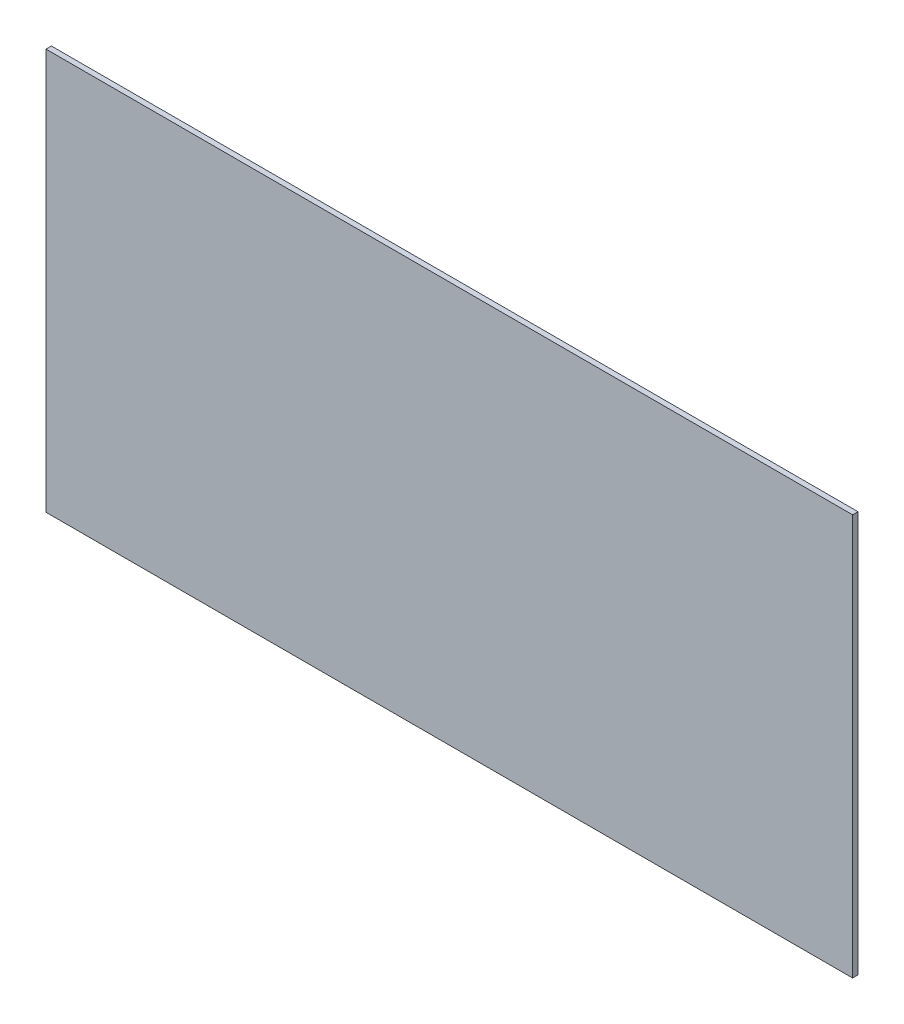
ISO-10303-21;
HEADER;
FILE_DESCRIPTION(('STEP AP214'),'2;1');
FILE_NAME('part.step','',(''),(''),'','','');
FILE_SCHEMA(('AUTOMOTIVE_DESIGN { 1 0 10303 214 1 1 1 1 }'));
ENDSEC;
DATA;
#1=APPLICATION_CONTEXT('core data for automotive mechanical design processes');
#2=APPLICATION_PROTOCOL_DEFINITION('international standard','automotive_design',2000,#1);
#3=PRODUCT_CONTEXT('',#1,'mechanical');
#4=PRODUCT('Part','Part','',(#3));
#5=PRODUCT_RELATED_PRODUCT_CATEGORY('part','',(#4));
#6=PRODUCT_DEFINITION_FORMATION('','',#4);
#7=PRODUCT_DEFINITION_CONTEXT('part definition',#1,'design');
#8=PRODUCT_DEFINITION('design','',#6,#7);
#9=PRODUCT_DEFINITION_SHAPE('','',#8);
#10=(LENGTH_UNIT() NAMED_UNIT(*) SI_UNIT(.MILLI.,.METRE.));
#11=(NAMED_UNIT(*) PLANE_ANGLE_UNIT() SI_UNIT($,.RADIAN.));
#12=(NAMED_UNIT(*) SI_UNIT($,.STERADIAN.) SOLID_ANGLE_UNIT());
#13=UNCERTAINTY_MEASURE_WITH_UNIT(LENGTH_MEASURE(1.E-05),#10,'distance_accuracy_value','');
#14=(GEOMETRIC_REPRESENTATION_CONTEXT(3) GLOBAL_UNCERTAINTY_ASSIGNED_CONTEXT((#13)) GLOBAL_UNIT_ASSIGNED_CONTEXT((#10,
#11,#12)) REPRESENTATION_CONTEXT('',''));
#15=CARTESIAN_POINT('',(0.,0.,0.));
#16=DIRECTION('',(0.,0.,1.));
#17=DIRECTION('',(1.,0.,0.));
#18=AXIS2_PLACEMENT_3D('',#15,#16,#17);
#19=CARTESIAN_POINT('',(0.,0.,10.));
#20=DIRECTION('',(1.,0.,0.));
#21=DIRECTION('',(0.,0.,-1.));
#22=AXIS2_PLACEMENT_3D('',#19,#20,#21);
#23=PLANE('',#22);
#24=DIRECTION('',(0.,-1.,0.));
#25=VECTOR('',#24,1.);
#26=CARTESIAN_POINT('',(0.,0.,0.));
#27=LINE('',#26,#25);
#28=CARTESIAN_POINT('',(0.,745.,0.));
#29=VERTEX_POINT('',#28);
#30=CARTESIAN_POINT('',(0.,0.,0.));
#31=VERTEX_POINT('',#30);
#32=EDGE_CURVE('E96',#29,#31,#27,.T.);
#33=ORIENTED_EDGE('',*,*,#32,.T.);
#34=DIRECTION('',(0.,0.,-1.));
#35=VECTOR('',#34,1.);
#36=CARTESIAN_POINT('',(0.,0.,10.));
#37=LINE('',#36,#35);
#38=CARTESIAN_POINT('',(0.,0.,10.));
#39=VERTEX_POINT('',#38);
#40=EDGE_CURVE('E11',#39,#31,#37,.T.);
#41=ORIENTED_EDGE('',*,*,#40,.F.);
#42=DIRECTION('',(0.,-1.,0.));
#43=VECTOR('',#42,1.);
#44=CARTESIAN_POINT('',(0.,0.,10.));
#45=LINE('',#44,#43);
#46=CARTESIAN_POINT('',(0.,745.,10.));
#47=VERTEX_POINT('',#46);
#48=EDGE_CURVE('E84',#47,#39,#45,.T.);
#49=ORIENTED_EDGE('',*,*,#48,.F.);
#50=DIRECTION('',(0.,0.,-1.));
#51=VECTOR('',#50,1.);
#52=CARTESIAN_POINT('',(0.,745.,10.));
#53=LINE('',#52,#51);
#54=EDGE_CURVE('E92',#47,#29,#53,.T.);
#55=ORIENTED_EDGE('',*,*,#54,.T.);
#56=EDGE_LOOP('',(#33,#41,#49,#55));
#57=FACE_BOUND('',#56,.T.);
#58=ADVANCED_FACE('F33',(#57),#23,.F.);
#59=CARTESIAN_POINT('',(0.,0.,10.));
#60=DIRECTION('',(0.,1.,0.));
#61=DIRECTION('',(0.,0.,1.));
#62=AXIS2_PLACEMENT_3D('',#59,#60,#61);
#63=PLANE('',#62);
#64=DIRECTION('',(1.,0.,0.));
#65=VECTOR('',#64,1.);
#66=CARTESIAN_POINT('',(0.,0.,0.));
#67=LINE('',#66,#65);
#68=CARTESIAN_POINT('',(1498.,0.,0.));
#69=VERTEX_POINT('',#68);
#70=EDGE_CURVE('E88',#31,#69,#67,.T.);
#71=ORIENTED_EDGE('',*,*,#70,.T.);
#72=DIRECTION('',(0.,0.,-1.));
#73=VECTOR('',#72,1.);
#74=CARTESIAN_POINT('',(1498.,0.,10.));
#75=LINE('',#74,#73);
#76=CARTESIAN_POINT('',(1498.,0.,10.));
#77=VERTEX_POINT('',#76);
#78=EDGE_CURVE('E41',#77,#69,#75,.T.);
#79=ORIENTED_EDGE('',*,*,#78,.F.);
#80=DIRECTION('',(1.,0.,0.));
#81=VECTOR('',#80,1.);
#82=CARTESIAN_POINT('',(0.,0.,10.));
#83=LINE('',#82,#81);
#84=EDGE_CURVE('E79',#39,#77,#83,.T.);
#85=ORIENTED_EDGE('',*,*,#84,.F.);
#86=ORIENTED_EDGE('',*,*,#40,.T.);
#87=EDGE_LOOP('',(#71,#79,#85,#86));
#88=FACE_BOUND('',#87,.T.);
#89=ADVANCED_FACE('F87',(#88),#63,.F.);
#90=CARTESIAN_POINT('',(1498.,0.,10.));
#91=DIRECTION('',(-1.,0.,0.));
#92=DIRECTION('',(0.,0.,1.));
#93=AXIS2_PLACEMENT_3D('',#90,#91,#92);
#94=PLANE('',#93);
#95=DIRECTION('',(0.,1.,0.));
#96=VECTOR('',#95,1.);
#97=CARTESIAN_POINT('',(1498.,0.,0.));
#98=LINE('',#97,#96);
#99=CARTESIAN_POINT('',(1498.,745.,0.));
#100=VERTEX_POINT('',#99);
#101=EDGE_CURVE('E66',#69,#100,#98,.T.);
#102=ORIENTED_EDGE('',*,*,#101,.T.);
#103=DIRECTION('',(0.,0.,-1.));
#104=VECTOR('',#103,1.);
#105=CARTESIAN_POINT('',(1498.,745.,10.));
#106=LINE('',#105,#104);
#107=CARTESIAN_POINT('',(1498.,745.,10.));
#108=VERTEX_POINT('',#107);
#109=EDGE_CURVE('E89',#108,#100,#106,.T.);
#110=ORIENTED_EDGE('',*,*,#109,.F.);
#111=DIRECTION('',(0.,1.,0.));
#112=VECTOR('',#111,1.);
#113=CARTESIAN_POINT('',(1498.,0.,10.));
#114=LINE('',#113,#112);
#115=EDGE_CURVE('E82',#77,#108,#114,.T.);
#116=ORIENTED_EDGE('',*,*,#115,.F.);
#117=ORIENTED_EDGE('',*,*,#78,.T.);
#118=EDGE_LOOP('',(#102,#110,#116,#117));
#119=FACE_BOUND('',#118,.T.);
#120=ADVANCED_FACE('F90',(#119),#94,.F.);
#121=CARTESIAN_POINT('',(0.,745.,10.));
#122=DIRECTION('',(0.,-1.,0.));
#123=DIRECTION('',(0.,0.,-1.));
#124=AXIS2_PLACEMENT_3D('',#121,#122,#123);
#125=PLANE('',#124);
#126=DIRECTION('',(-1.,0.,0.));
#127=VECTOR('',#126,1.);
#128=CARTESIAN_POINT('',(0.,745.,0.));
#129=LINE('',#128,#127);
#130=EDGE_CURVE('E72',#100,#29,#129,.T.);
#131=ORIENTED_EDGE('',*,*,#130,.T.);
#132=ORIENTED_EDGE('',*,*,#54,.F.);
#133=DIRECTION('',(-1.,0.,0.));
#134=VECTOR('',#133,1.);
#135=CARTESIAN_POINT('',(0.,745.,10.));
#136=LINE('',#135,#134);
#137=EDGE_CURVE('E49',#108,#47,#136,.T.);
#138=ORIENTED_EDGE('',*,*,#137,.F.);
#139=ORIENTED_EDGE('',*,*,#109,.T.);
#140=EDGE_LOOP('',(#131,#132,#138,#139));
#141=FACE_BOUND('',#140,.T.);
#142=ADVANCED_FACE('F103',(#141),#125,.F.);
#143=CARTESIAN_POINT('',(0.,0.,10.));
#144=DIRECTION('',(0.,0.,-1.));
#145=DIRECTION('',(-1.,0.,0.));
#146=AXIS2_PLACEMENT_3D('',#143,#144,#145);
#147=PLANE('',#146);
#148=ORIENTED_EDGE('',*,*,#48,.T.);
#149=ORIENTED_EDGE('',*,*,#84,.T.);
#150=ORIENTED_EDGE('',*,*,#115,.T.);
#151=ORIENTED_EDGE('',*,*,#137,.T.);
#152=EDGE_LOOP('',(#148,#149,#150,#151));
#153=FACE_BOUND('',#152,.T.);
#154=ADVANCED_FACE('F80',(#153),#147,.F.);
#155=CARTESIAN_POINT('',(0.,0.,0.));
#156=DIRECTION('',(0.,0.,-1.));
#157=DIRECTION('',(-1.,0.,0.));
#158=AXIS2_PLACEMENT_3D('',#155,#156,#157);
#159=PLANE('',#158);
#160=ORIENTED_EDGE('',*,*,#32,.F.);
#161=ORIENTED_EDGE('',*,*,#130,.F.);
#162=ORIENTED_EDGE('',*,*,#101,.F.);
#163=ORIENTED_EDGE('',*,*,#70,.F.);
#164=EDGE_LOOP('',(#160,#161,#162,#163));
#165=FACE_BOUND('',#164,.T.);
#166=ADVANCED_FACE('F106',(#165),#159,.T.);
#167=CLOSED_SHELL('',(#58,#89,#120,#142,#154,#166));
#168=MANIFOLD_SOLID_BREP('B2',#167);
#169=ADVANCED_BREP_SHAPE_REPRESENTATION('',(#18,#168),#14);
#170=SHAPE_DEFINITION_REPRESENTATION(#9,#169);
ENDSEC;
END-ISO-10303-21;
